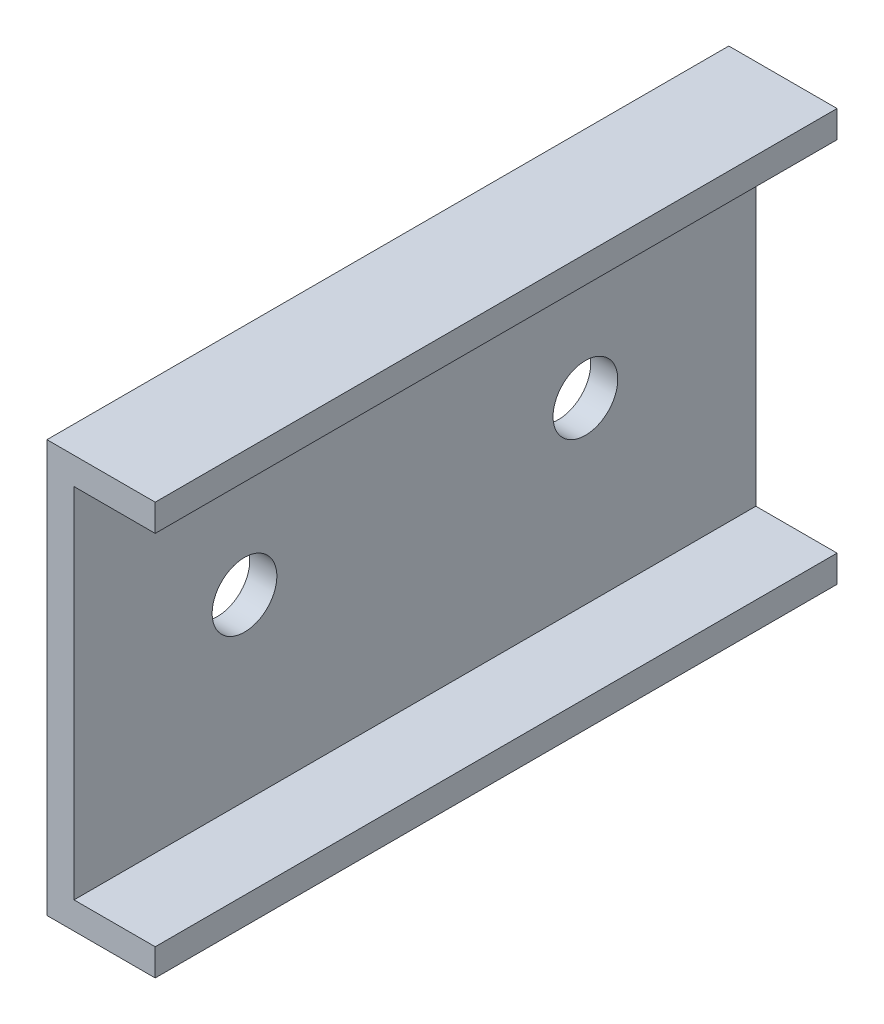
ISO-10303-21;
HEADER;
FILE_DESCRIPTION(('STEP AP214'),'2;1');
FILE_NAME('part.step','',(''),(''),'','','');
FILE_SCHEMA(('AUTOMOTIVE_DESIGN { 1 0 10303 214 1 1 1 1 }'));
ENDSEC;
DATA;
#1=APPLICATION_CONTEXT('core data for automotive mechanical design processes');
#2=APPLICATION_PROTOCOL_DEFINITION('international standard','automotive_design',2000,#1);
#3=PRODUCT_CONTEXT('',#1,'mechanical');
#4=PRODUCT('Part','Part','',(#3));
#5=PRODUCT_RELATED_PRODUCT_CATEGORY('part','',(#4));
#6=PRODUCT_DEFINITION_FORMATION('','',#4);
#7=PRODUCT_DEFINITION_CONTEXT('part definition',#1,'design');
#8=PRODUCT_DEFINITION('design','',#6,#7);
#9=PRODUCT_DEFINITION_SHAPE('','',#8);
#10=(LENGTH_UNIT() NAMED_UNIT(*) SI_UNIT(.MILLI.,.METRE.));
#11=(NAMED_UNIT(*) PLANE_ANGLE_UNIT() SI_UNIT($,.RADIAN.));
#12=(NAMED_UNIT(*) SI_UNIT($,.STERADIAN.) SOLID_ANGLE_UNIT());
#13=UNCERTAINTY_MEASURE_WITH_UNIT(LENGTH_MEASURE(1.E-05),#10,'distance_accuracy_value','');
#14=(GEOMETRIC_REPRESENTATION_CONTEXT(3) GLOBAL_UNCERTAINTY_ASSIGNED_CONTEXT((#13)) GLOBAL_UNIT_ASSIGNED_CONTEXT((#10,
#11,#12)) REPRESENTATION_CONTEXT('',''));
#15=CARTESIAN_POINT('',(0.,0.,0.));
#16=DIRECTION('',(0.,0.,1.));
#17=DIRECTION('',(1.,0.,0.));
#18=AXIS2_PLACEMENT_3D('',#15,#16,#17);
#19=CARTESIAN_POINT('',(1.5875,1.5875,20.));
#20=DIRECTION('',(-1.,0.,0.));
#21=DIRECTION('',(0.,0.,1.));
#22=AXIS2_PLACEMENT_3D('',#19,#20,#21);
#23=PLANE('',#22);
#24=DIRECTION('',(0.,0.,-1.));
#25=VECTOR('',#24,1.);
#26=CARTESIAN_POINT('',(1.5875,1.5875,20.));
#27=LINE('',#26,#25);
#28=CARTESIAN_POINT('',(1.5875,1.5875,20.));
#29=VERTEX_POINT('',#28);
#30=CARTESIAN_POINT('',(1.5875,1.5875,-20.));
#31=VERTEX_POINT('',#30);
#32=EDGE_CURVE('E163',#29,#31,#27,.T.);
#33=ORIENTED_EDGE('',*,*,#32,.T.);
#34=DIRECTION('',(0.,1.,0.));
#35=VECTOR('',#34,1.);
#36=CARTESIAN_POINT('',(1.5875,1.5875,-20.));
#37=LINE('',#36,#35);
#38=CARTESIAN_POINT('',(1.5875,22.5875,-20.));
#39=VERTEX_POINT('',#38);
#40=EDGE_CURVE('E129',#31,#39,#37,.T.);
#41=ORIENTED_EDGE('',*,*,#40,.T.);
#42=DIRECTION('',(0.,0.,-1.));
#43=VECTOR('',#42,1.);
#44=CARTESIAN_POINT('',(1.5875,22.5875,20.));
#45=LINE('',#44,#43);
#46=CARTESIAN_POINT('',(1.5875,22.5875,20.));
#47=VERTEX_POINT('',#46);
#48=EDGE_CURVE('E161',#47,#39,#45,.T.);
#49=ORIENTED_EDGE('',*,*,#48,.F.);
#50=DIRECTION('',(0.,1.,0.));
#51=VECTOR('',#50,1.);
#52=CARTESIAN_POINT('',(1.5875,1.5875,20.));
#53=LINE('',#52,#51);
#54=EDGE_CURVE('E152',#29,#47,#53,.T.);
#55=ORIENTED_EDGE('',*,*,#54,.F.);
#56=EDGE_LOOP('',(#33,#41,#49,#55));
#57=FACE_BOUND('',#56,.T.);
#58=CARTESIAN_POINT('',(1.5875,12.0875,10.));
#59=DIRECTION('',(-1.,0.,0.));
#60=DIRECTION('',(0.,0.,1.));
#61=AXIS2_PLACEMENT_3D('',#58,#59,#60);
#62=CIRCLE('',#61,1.89864999999999);
#63=CARTESIAN_POINT('',(1.5875,12.0875,11.89865));
#64=VERTEX_POINT('',#63);
#65=EDGE_CURVE('E140',#64,#64,#62,.F.);
#66=ORIENTED_EDGE('',*,*,#65,.F.);
#67=EDGE_LOOP('',(#66));
#68=FACE_BOUND('',#67,.T.);
#69=CARTESIAN_POINT('',(1.5875,12.0875,-10.));
#70=DIRECTION('',(-1.,0.,0.));
#71=DIRECTION('',(0.,0.,1.));
#72=AXIS2_PLACEMENT_3D('',#69,#70,#71);
#73=CIRCLE('',#72,1.89864999999999);
#74=CARTESIAN_POINT('',(1.5875,12.0875,-8.10135));
#75=VERTEX_POINT('',#74);
#76=EDGE_CURVE('E118',#75,#75,#73,.F.);
#77=ORIENTED_EDGE('',*,*,#76,.F.);
#78=EDGE_LOOP('',(#77));
#79=FACE_BOUND('',#78,.T.);
#80=ADVANCED_FACE('F35',(#57,#68,#79),#23,.F.);
#81=CARTESIAN_POINT('',(0.,0.,20.));
#82=DIRECTION('',(1.,0.,0.));
#83=DIRECTION('',(0.,0.,-1.));
#84=AXIS2_PLACEMENT_3D('',#81,#82,#83);
#85=PLANE('',#84);
#86=CARTESIAN_POINT('',(0.,12.0875,-10.));
#87=DIRECTION('',(-1.,0.,0.));
#88=DIRECTION('',(0.,0.,1.));
#89=AXIS2_PLACEMENT_3D('',#86,#87,#88);
#90=CIRCLE('',#89,1.89864999999999);
#91=CARTESIAN_POINT('',(0.,12.0875,-8.10135000000001));
#92=VERTEX_POINT('',#91);
#93=EDGE_CURVE('E312',#92,#92,#90,.T.);
#94=ORIENTED_EDGE('',*,*,#93,.F.);
#95=EDGE_LOOP('',(#94));
#96=FACE_BOUND('',#95,.T.);
#97=CARTESIAN_POINT('',(0.,12.0875,10.));
#98=DIRECTION('',(-1.,0.,0.));
#99=DIRECTION('',(0.,0.,1.));
#100=AXIS2_PLACEMENT_3D('',#97,#98,#99);
#101=CIRCLE('',#100,1.89864999999999);
#102=CARTESIAN_POINT('',(0.,12.0875,11.89865));
#103=VERTEX_POINT('',#102);
#104=EDGE_CURVE('E139',#103,#103,#101,.T.);
#105=ORIENTED_EDGE('',*,*,#104,.F.);
#106=EDGE_LOOP('',(#105));
#107=FACE_BOUND('',#106,.T.);
#108=DIRECTION('',(0.,0.,-1.));
#109=VECTOR('',#108,1.);
#110=CARTESIAN_POINT('',(0.,24.175,20.));
#111=LINE('',#110,#109);
#112=CARTESIAN_POINT('',(0.,24.175,20.));
#113=VERTEX_POINT('',#112);
#114=CARTESIAN_POINT('',(0.,24.175,-20.));
#115=VERTEX_POINT('',#114);
#116=EDGE_CURVE('E99',#113,#115,#111,.T.);
#117=ORIENTED_EDGE('',*,*,#116,.T.);
#118=DIRECTION('',(0.,-1.,0.));
#119=VECTOR('',#118,1.);
#120=CARTESIAN_POINT('',(0.,0.,-20.));
#121=LINE('',#120,#119);
#122=CARTESIAN_POINT('',(0.,0.,-20.));
#123=VERTEX_POINT('',#122);
#124=EDGE_CURVE('E102',#115,#123,#121,.T.);
#125=ORIENTED_EDGE('',*,*,#124,.T.);
#126=DIRECTION('',(0.,0.,-1.));
#127=VECTOR('',#126,1.);
#128=CARTESIAN_POINT('',(0.,0.,20.));
#129=LINE('',#128,#127);
#130=CARTESIAN_POINT('',(0.,0.,20.));
#131=VERTEX_POINT('',#130);
#132=EDGE_CURVE('E11',#131,#123,#129,.T.);
#133=ORIENTED_EDGE('',*,*,#132,.F.);
#134=DIRECTION('',(0.,-1.,0.));
#135=VECTOR('',#134,1.);
#136=CARTESIAN_POINT('',(0.,0.,20.));
#137=LINE('',#136,#135);
#138=EDGE_CURVE('E104',#113,#131,#137,.T.);
#139=ORIENTED_EDGE('',*,*,#138,.F.);
#140=EDGE_LOOP('',(#117,#125,#133,#139));
#141=FACE_BOUND('',#140,.T.);
#142=ADVANCED_FACE('F37',(#96,#107,#141),#85,.F.);
#143=CARTESIAN_POINT('',(0.,0.,20.));
#144=DIRECTION('',(0.,1.,0.));
#145=DIRECTION('',(0.,0.,1.));
#146=AXIS2_PLACEMENT_3D('',#143,#144,#145);
#147=PLANE('',#146);
#148=ORIENTED_EDGE('',*,*,#132,.T.);
#149=DIRECTION('',(1.,0.,0.));
#150=VECTOR('',#149,1.);
#151=CARTESIAN_POINT('',(0.,0.,-20.));
#152=LINE('',#151,#150);
#153=CARTESIAN_POINT('',(6.35,0.,-20.));
#154=VERTEX_POINT('',#153);
#155=EDGE_CURVE('E117',#123,#154,#152,.T.);
#156=ORIENTED_EDGE('',*,*,#155,.T.);
#157=DIRECTION('',(0.,0.,-1.));
#158=VECTOR('',#157,1.);
#159=CARTESIAN_POINT('',(6.35,0.,20.));
#160=LINE('',#159,#158);
#161=CARTESIAN_POINT('',(6.35,0.,20.));
#162=VERTEX_POINT('',#161);
#163=EDGE_CURVE('E43',#162,#154,#160,.T.);
#164=ORIENTED_EDGE('',*,*,#163,.F.);
#165=DIRECTION('',(1.,0.,0.));
#166=VECTOR('',#165,1.);
#167=CARTESIAN_POINT('',(0.,0.,20.));
#168=LINE('',#167,#166);
#169=EDGE_CURVE('E146',#131,#162,#168,.T.);
#170=ORIENTED_EDGE('',*,*,#169,.F.);
#171=EDGE_LOOP('',(#148,#156,#164,#170));
#172=FACE_BOUND('',#171,.T.);
#173=ADVANCED_FACE('F174',(#172),#147,.F.);
#174=CARTESIAN_POINT('',(6.35,1.5875,20.));
#175=DIRECTION('',(-1.,0.,0.));
#176=DIRECTION('',(0.,0.,1.));
#177=AXIS2_PLACEMENT_3D('',#174,#175,#176);
#178=PLANE('',#177);
#179=ORIENTED_EDGE('',*,*,#163,.T.);
#180=DIRECTION('',(0.,1.,0.));
#181=VECTOR('',#180,1.);
#182=CARTESIAN_POINT('',(6.35,1.5875,-20.));
#183=LINE('',#182,#181);
#184=CARTESIAN_POINT('',(6.35,1.5875,-20.));
#185=VERTEX_POINT('',#184);
#186=EDGE_CURVE('E135',#154,#185,#183,.T.);
#187=ORIENTED_EDGE('',*,*,#186,.T.);
#188=DIRECTION('',(0.,0.,-1.));
#189=VECTOR('',#188,1.);
#190=CARTESIAN_POINT('',(6.35,1.5875,20.));
#191=LINE('',#190,#189);
#192=CARTESIAN_POINT('',(6.35,1.5875,20.));
#193=VERTEX_POINT('',#192);
#194=EDGE_CURVE('E165',#193,#185,#191,.T.);
#195=ORIENTED_EDGE('',*,*,#194,.F.);
#196=DIRECTION('',(0.,1.,0.));
#197=VECTOR('',#196,1.);
#198=CARTESIAN_POINT('',(6.35,1.5875,20.));
#199=LINE('',#198,#197);
#200=EDGE_CURVE('E148',#162,#193,#199,.T.);
#201=ORIENTED_EDGE('',*,*,#200,.F.);
#202=EDGE_LOOP('',(#179,#187,#195,#201));
#203=FACE_BOUND('',#202,.T.);
#204=ADVANCED_FACE('F169',(#203),#178,.F.);
#205=CARTESIAN_POINT('',(1.5875,1.5875,20.));
#206=DIRECTION('',(0.,-1.,0.));
#207=DIRECTION('',(0.,0.,-1.));
#208=AXIS2_PLACEMENT_3D('',#205,#206,#207);
#209=PLANE('',#208);
#210=ORIENTED_EDGE('',*,*,#194,.T.);
#211=DIRECTION('',(-1.,0.,0.));
#212=VECTOR('',#211,1.);
#213=CARTESIAN_POINT('',(1.5875,1.5875,-20.));
#214=LINE('',#213,#212);
#215=EDGE_CURVE('E132',#185,#31,#214,.T.);
#216=ORIENTED_EDGE('',*,*,#215,.T.);
#217=ORIENTED_EDGE('',*,*,#32,.F.);
#218=DIRECTION('',(-1.,0.,0.));
#219=VECTOR('',#218,1.);
#220=CARTESIAN_POINT('',(1.5875,1.5875,20.));
#221=LINE('',#220,#219);
#222=EDGE_CURVE('E150',#193,#29,#221,.T.);
#223=ORIENTED_EDGE('',*,*,#222,.F.);
#224=EDGE_LOOP('',(#210,#216,#217,#223));
#225=FACE_BOUND('',#224,.T.);
#226=ADVANCED_FACE('F199',(#225),#209,.F.);
#227=CARTESIAN_POINT('',(1.5875,22.5875,20.));
#228=DIRECTION('',(0.,1.,0.));
#229=DIRECTION('',(0.,0.,1.));
#230=AXIS2_PLACEMENT_3D('',#227,#228,#229);
#231=PLANE('',#230);
#232=ORIENTED_EDGE('',*,*,#48,.T.);
#233=DIRECTION('',(1.,0.,0.));
#234=VECTOR('',#233,1.);
#235=CARTESIAN_POINT('',(1.5875,22.5875,-20.));
#236=LINE('',#235,#234);
#237=CARTESIAN_POINT('',(6.35,22.5875,-20.));
#238=VERTEX_POINT('',#237);
#239=EDGE_CURVE('E123',#39,#238,#236,.T.);
#240=ORIENTED_EDGE('',*,*,#239,.T.);
#241=DIRECTION('',(0.,0.,-1.));
#242=VECTOR('',#241,1.);
#243=CARTESIAN_POINT('',(6.35,22.5875,20.));
#244=LINE('',#243,#242);
#245=CARTESIAN_POINT('',(6.35,22.5875,20.));
#246=VERTEX_POINT('',#245);
#247=EDGE_CURVE('E159',#246,#238,#244,.T.);
#248=ORIENTED_EDGE('',*,*,#247,.F.);
#249=DIRECTION('',(1.,0.,0.));
#250=VECTOR('',#249,1.);
#251=CARTESIAN_POINT('',(1.5875,22.5875,20.));
#252=LINE('',#251,#250);
#253=EDGE_CURVE('E154',#47,#246,#252,.T.);
#254=ORIENTED_EDGE('',*,*,#253,.F.);
#255=EDGE_LOOP('',(#232,#240,#248,#254));
#256=FACE_BOUND('',#255,.T.);
#257=ADVANCED_FACE('F197',(#256),#231,.F.);
#258=CARTESIAN_POINT('',(6.35,22.5875,20.));
#259=DIRECTION('',(-1.,0.,0.));
#260=DIRECTION('',(0.,0.,1.));
#261=AXIS2_PLACEMENT_3D('',#258,#259,#260);
#262=PLANE('',#261);
#263=ORIENTED_EDGE('',*,*,#247,.T.);
#264=DIRECTION('',(0.,1.,0.));
#265=VECTOR('',#264,1.);
#266=CARTESIAN_POINT('',(6.35,22.5875,-20.));
#267=LINE('',#266,#265);
#268=CARTESIAN_POINT('',(6.35,24.175,-20.));
#269=VERTEX_POINT('',#268);
#270=EDGE_CURVE('E121',#238,#269,#267,.T.);
#271=ORIENTED_EDGE('',*,*,#270,.T.);
#272=DIRECTION('',(0.,0.,-1.));
#273=VECTOR('',#272,1.);
#274=CARTESIAN_POINT('',(6.35,24.175,20.));
#275=LINE('',#274,#273);
#276=CARTESIAN_POINT('',(6.35,24.175,20.));
#277=VERTEX_POINT('',#276);
#278=EDGE_CURVE('E107',#277,#269,#275,.T.);
#279=ORIENTED_EDGE('',*,*,#278,.F.);
#280=DIRECTION('',(0.,1.,0.));
#281=VECTOR('',#280,1.);
#282=CARTESIAN_POINT('',(6.35,22.5875,20.));
#283=LINE('',#282,#281);
#284=EDGE_CURVE('E55',#246,#277,#283,.T.);
#285=ORIENTED_EDGE('',*,*,#284,.F.);
#286=EDGE_LOOP('',(#263,#271,#279,#285));
#287=FACE_BOUND('',#286,.T.);
#288=ADVANCED_FACE('F185',(#287),#262,.F.);
#289=CARTESIAN_POINT('',(0.,24.175,20.));
#290=DIRECTION('',(0.,-1.,0.));
#291=DIRECTION('',(0.,0.,-1.));
#292=AXIS2_PLACEMENT_3D('',#289,#290,#291);
#293=PLANE('',#292);
#294=ORIENTED_EDGE('',*,*,#278,.T.);
#295=DIRECTION('',(-1.,0.,0.));
#296=VECTOR('',#295,1.);
#297=CARTESIAN_POINT('',(0.,24.175,-20.));
#298=LINE('',#297,#296);
#299=EDGE_CURVE('E113',#269,#115,#298,.T.);
#300=ORIENTED_EDGE('',*,*,#299,.T.);
#301=ORIENTED_EDGE('',*,*,#116,.F.);
#302=DIRECTION('',(-1.,0.,0.));
#303=VECTOR('',#302,1.);
#304=CARTESIAN_POINT('',(0.,24.175,20.));
#305=LINE('',#304,#303);
#306=EDGE_CURVE('E50',#277,#113,#305,.T.);
#307=ORIENTED_EDGE('',*,*,#306,.F.);
#308=EDGE_LOOP('',(#294,#300,#301,#307));
#309=FACE_BOUND('',#308,.T.);
#310=ADVANCED_FACE('F120',(#309),#293,.F.);
#311=CARTESIAN_POINT('',(0.,0.,20.));
#312=DIRECTION('',(0.,0.,-1.));
#313=DIRECTION('',(-1.,0.,0.));
#314=AXIS2_PLACEMENT_3D('',#311,#312,#313);
#315=PLANE('',#314);
#316=ORIENTED_EDGE('',*,*,#138,.T.);
#317=ORIENTED_EDGE('',*,*,#169,.T.);
#318=ORIENTED_EDGE('',*,*,#200,.T.);
#319=ORIENTED_EDGE('',*,*,#222,.T.);
#320=ORIENTED_EDGE('',*,*,#54,.T.);
#321=ORIENTED_EDGE('',*,*,#253,.T.);
#322=ORIENTED_EDGE('',*,*,#284,.T.);
#323=ORIENTED_EDGE('',*,*,#306,.T.);
#324=EDGE_LOOP('',(#316,#317,#318,#319,#320,#321,#322,#323));
#325=FACE_BOUND('',#324,.T.);
#326=ADVANCED_FACE('F175',(#325),#315,.F.);
#327=CARTESIAN_POINT('',(0.,12.0875,10.));
#328=DIRECTION('',(-1.,0.,0.));
#329=DIRECTION('',(0.,0.,1.));
#330=AXIS2_PLACEMENT_3D('',#327,#328,#329);
#331=CYLINDRICAL_SURFACE('',#330,1.89864999999999);
#332=ORIENTED_EDGE('',*,*,#65,.T.);
#333=EDGE_LOOP('',(#332));
#334=FACE_BOUND('',#333,.T.);
#335=ORIENTED_EDGE('',*,*,#104,.T.);
#336=EDGE_LOOP('',(#335));
#337=FACE_BOUND('',#336,.T.);
#338=ADVANCED_FACE('F177',(#334,#337),#331,.F.);
#339=CARTESIAN_POINT('',(0.,0.,-20.));
#340=DIRECTION('',(0.,0.,1.));
#341=DIRECTION('',(-1.,0.,0.));
#342=AXIS2_PLACEMENT_3D('',#339,#340,#341);
#343=PLANE('',#342);
#344=ORIENTED_EDGE('',*,*,#124,.F.);
#345=ORIENTED_EDGE('',*,*,#299,.F.);
#346=ORIENTED_EDGE('',*,*,#270,.F.);
#347=ORIENTED_EDGE('',*,*,#239,.F.);
#348=ORIENTED_EDGE('',*,*,#40,.F.);
#349=ORIENTED_EDGE('',*,*,#215,.F.);
#350=ORIENTED_EDGE('',*,*,#186,.F.);
#351=ORIENTED_EDGE('',*,*,#155,.F.);
#352=EDGE_LOOP('',(#344,#345,#346,#347,#348,#349,#350,#351));
#353=FACE_BOUND('',#352,.T.);
#354=ADVANCED_FACE('F111',(#353),#343,.F.);
#355=CARTESIAN_POINT('',(0.,12.0875,-10.));
#356=DIRECTION('',(-1.,0.,0.));
#357=DIRECTION('',(0.,0.,1.));
#358=AXIS2_PLACEMENT_3D('',#355,#356,#357);
#359=CYLINDRICAL_SURFACE('',#358,1.89864999999999);
#360=ORIENTED_EDGE('',*,*,#76,.T.);
#361=EDGE_LOOP('',(#360));
#362=FACE_BOUND('',#361,.T.);
#363=ORIENTED_EDGE('',*,*,#93,.T.);
#364=EDGE_LOOP('',(#363));
#365=FACE_BOUND('',#364,.T.);
#366=ADVANCED_FACE('F243',(#362,#365),#359,.F.);
#367=CLOSED_SHELL('',(#80,#142,#173,#204,#226,#257,#288,#310,#326,#338,#354,#366));
#368=MANIFOLD_SOLID_BREP('B2',#367);
#369=ADVANCED_BREP_SHAPE_REPRESENTATION('',(#18,#368),#14);
#370=SHAPE_DEFINITION_REPRESENTATION(#9,#369);
ENDSEC;
END-ISO-10303-21;
